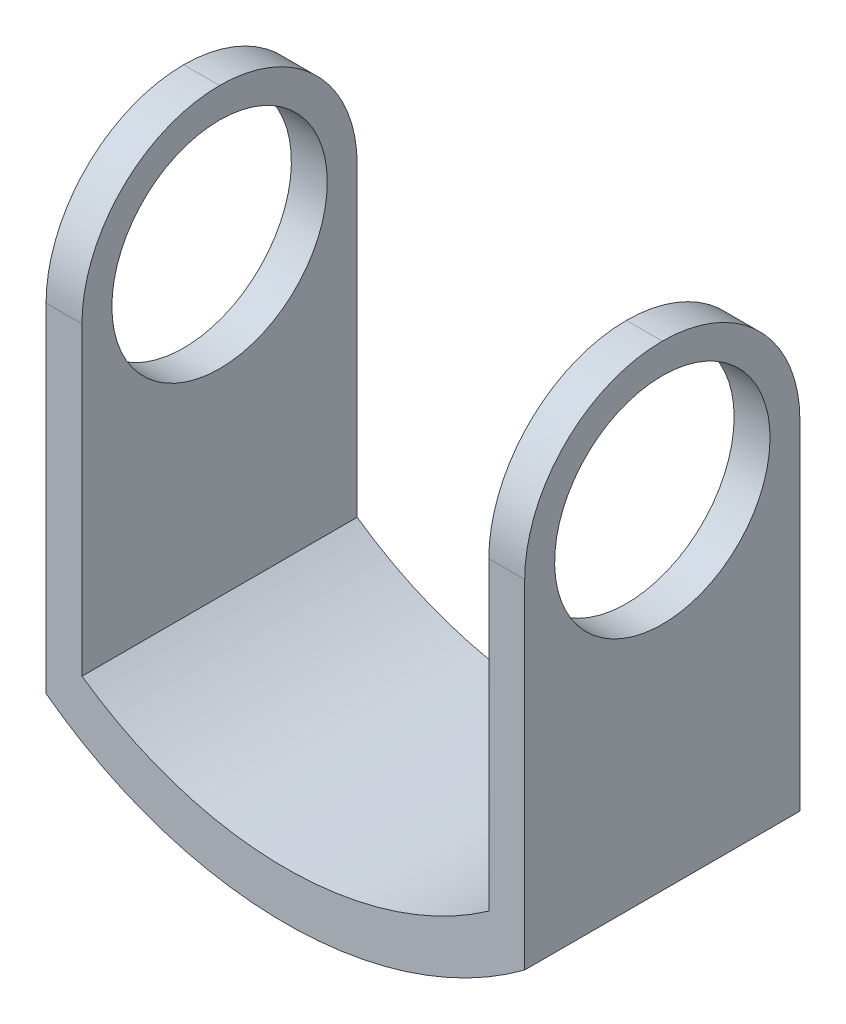
ISO-10303-21;
HEADER;
FILE_DESCRIPTION(('STEP AP214'),'2;1');
FILE_NAME('part.step','',(''),(''),'','','');
FILE_SCHEMA(('AUTOMOTIVE_DESIGN { 1 0 10303 214 1 1 1 1 }'));
ENDSEC;
DATA;
#1=APPLICATION_CONTEXT('core data for automotive mechanical design processes');
#2=APPLICATION_PROTOCOL_DEFINITION('international standard','automotive_design',2000,#1);
#3=PRODUCT_CONTEXT('',#1,'mechanical');
#4=PRODUCT('Part','Part','',(#3));
#5=PRODUCT_RELATED_PRODUCT_CATEGORY('part','',(#4));
#6=PRODUCT_DEFINITION_FORMATION('','',#4);
#7=PRODUCT_DEFINITION_CONTEXT('part definition',#1,'design');
#8=PRODUCT_DEFINITION('design','',#6,#7);
#9=PRODUCT_DEFINITION_SHAPE('','',#8);
#10=(LENGTH_UNIT() NAMED_UNIT(*) SI_UNIT(.MILLI.,.METRE.));
#11=(NAMED_UNIT(*) PLANE_ANGLE_UNIT() SI_UNIT($,.RADIAN.));
#12=(NAMED_UNIT(*) SI_UNIT($,.STERADIAN.) SOLID_ANGLE_UNIT());
#13=UNCERTAINTY_MEASURE_WITH_UNIT(LENGTH_MEASURE(1.E-05),#10,'distance_accuracy_value','');
#14=(GEOMETRIC_REPRESENTATION_CONTEXT(3) GLOBAL_UNCERTAINTY_ASSIGNED_CONTEXT((#13)) GLOBAL_UNIT_ASSIGNED_CONTEXT((#10,
#11,#12)) REPRESENTATION_CONTEXT('',''));
#15=CARTESIAN_POINT('',(0.,0.,0.));
#16=DIRECTION('',(0.,0.,1.));
#17=DIRECTION('',(1.,0.,0.));
#18=AXIS2_PLACEMENT_3D('',#15,#16,#17);
#19=CARTESIAN_POINT('',(-10.,0.,11.5));
#20=DIRECTION('',(1.,0.,0.));
#21=DIRECTION('',(0.,1.,0.));
#22=AXIS2_PLACEMENT_3D('',#19,#20,#21);
#23=PLANE('',#22);
#24=CARTESIAN_POINT('',(-10.,-5.75,5.75));
#25=DIRECTION('',(1.,0.,0.));
#26=DIRECTION('',(0.,1.,0.));
#27=AXIS2_PLACEMENT_3D('',#24,#25,#26);
#28=CIRCLE('',#27,4.5);
#29=CARTESIAN_POINT('',(-10.,-1.25,5.75));
#30=VERTEX_POINT('',#29);
#31=EDGE_CURVE('E149',#30,#30,#28,.F.);
#32=ORIENTED_EDGE('',*,*,#31,.F.);
#33=EDGE_LOOP('',(#32));
#34=FACE_BOUND('',#33,.T.);
#35=CARTESIAN_POINT('',(-10.,-5.75,5.75));
#36=DIRECTION('',(1.,0.,0.));
#37=DIRECTION('',(0.,1.,0.));
#38=AXIS2_PLACEMENT_3D('',#35,#36,#37);
#39=CIRCLE('',#38,5.75);
#40=CARTESIAN_POINT('',(-10.,-5.75,11.5));
#41=VERTEX_POINT('',#40);
#42=CARTESIAN_POINT('',(-10.,0.,5.75));
#43=VERTEX_POINT('',#42);
#44=EDGE_CURVE('E138',#41,#43,#39,.F.);
#45=ORIENTED_EDGE('',*,*,#44,.T.);
#46=CARTESIAN_POINT('',(-10.,-5.75,5.75));
#47=DIRECTION('',(1.,0.,0.));
#48=DIRECTION('',(0.,1.,0.));
#49=AXIS2_PLACEMENT_3D('',#46,#47,#48);
#50=CIRCLE('',#49,5.75);
#51=CARTESIAN_POINT('',(-10.,-5.75,0.));
#52=VERTEX_POINT('',#51);
#53=EDGE_CURVE('E140',#43,#52,#50,.F.);
#54=ORIENTED_EDGE('',*,*,#53,.T.);
#55=DIRECTION('',(0.,-1.,0.));
#56=VECTOR('',#55,1.);
#57=CARTESIAN_POINT('',(-10.,0.,0.));
#58=LINE('',#57,#56);
#59=CARTESIAN_POINT('',(-9.99999999999999,-19.8827911991355,0.));
#60=VERTEX_POINT('',#59);
#61=EDGE_CURVE('E136',#52,#60,#58,.T.);
#62=ORIENTED_EDGE('',*,*,#61,.T.);
#63=DIRECTION('',(0.,0.,-1.));
#64=VECTOR('',#63,1.);
#65=CARTESIAN_POINT('',(-9.99999999999999,-19.8827911991355,11.5));
#66=LINE('',#65,#64);
#67=CARTESIAN_POINT('',(-9.99999999999999,-19.8827911991355,11.5));
#68=VERTEX_POINT('',#67);
#69=EDGE_CURVE('E129',#68,#60,#66,.T.);
#70=ORIENTED_EDGE('',*,*,#69,.F.);
#71=DIRECTION('',(0.,-1.,0.));
#72=VECTOR('',#71,1.);
#73=CARTESIAN_POINT('',(-10.,0.,11.5));
#74=LINE('',#73,#72);
#75=EDGE_CURVE('E112',#41,#68,#74,.T.);
#76=ORIENTED_EDGE('',*,*,#75,.F.);
#77=EDGE_LOOP('',(#45,#54,#62,#70,#76));
#78=FACE_BOUND('',#77,.T.);
#79=ADVANCED_FACE('F35',(#34,#78),#23,.F.);
#80=CARTESIAN_POINT('',(0.,-6.4454365487588,11.5));
#81=DIRECTION('',(0.,0.,-1.));
#82=DIRECTION('',(-1.,0.,0.));
#83=AXIS2_PLACEMENT_3D('',#80,#81,#82);
#84=CYLINDRICAL_SURFACE('',#83,16.75);
#85=CARTESIAN_POINT('',(0.,-6.4454365487588,0.));
#86=DIRECTION('',(0.,0.,1.));
#87=DIRECTION('',(1.,0.,0.));
#88=AXIS2_PLACEMENT_3D('',#85,#86,#87);
#89=CIRCLE('',#88,16.75);
#90=CARTESIAN_POINT('',(10.,-19.8827911991355,0.));
#91=VERTEX_POINT('',#90);
#92=EDGE_CURVE('E194',#60,#91,#89,.T.);
#93=ORIENTED_EDGE('',*,*,#92,.T.);
#94=DIRECTION('',(0.,0.,-1.));
#95=VECTOR('',#94,1.);
#96=CARTESIAN_POINT('',(10.,-19.8827911991355,11.5));
#97=LINE('',#96,#95);
#98=CARTESIAN_POINT('',(10.,-19.8827911991355,11.5));
#99=VERTEX_POINT('',#98);
#100=EDGE_CURVE('E131',#99,#91,#97,.T.);
#101=ORIENTED_EDGE('',*,*,#100,.F.);
#102=CARTESIAN_POINT('',(0.,-6.4454365487588,11.5));
#103=DIRECTION('',(0.,0.,1.));
#104=DIRECTION('',(1.,0.,0.));
#105=AXIS2_PLACEMENT_3D('',#102,#103,#104);
#106=CIRCLE('',#105,16.75);
#107=EDGE_CURVE('E117',#68,#99,#106,.T.);
#108=ORIENTED_EDGE('',*,*,#107,.F.);
#109=ORIENTED_EDGE('',*,*,#69,.T.);
#110=EDGE_LOOP('',(#93,#101,#108,#109));
#111=FACE_BOUND('',#110,.T.);
#112=ADVANCED_FACE('F128',(#111),#84,.T.);
#113=CARTESIAN_POINT('',(10.,0.,11.5));
#114=DIRECTION('',(-1.,0.,0.));
#115=DIRECTION('',(0.,-1.,0.));
#116=AXIS2_PLACEMENT_3D('',#113,#114,#115);
#117=PLANE('',#116);
#118=CARTESIAN_POINT('',(10.,-5.75,5.75));
#119=DIRECTION('',(1.,0.,0.));
#120=DIRECTION('',(0.,1.,0.));
#121=AXIS2_PLACEMENT_3D('',#118,#119,#120);
#122=CIRCLE('',#121,4.5);
#123=CARTESIAN_POINT('',(10.,-1.25,5.75));
#124=VERTEX_POINT('',#123);
#125=EDGE_CURVE('E170',#124,#124,#122,.T.);
#126=ORIENTED_EDGE('',*,*,#125,.F.);
#127=EDGE_LOOP('',(#126));
#128=FACE_BOUND('',#127,.T.);
#129=DIRECTION('',(0.,1.,0.));
#130=VECTOR('',#129,1.);
#131=CARTESIAN_POINT('',(10.,0.,0.));
#132=LINE('',#131,#130);
#133=CARTESIAN_POINT('',(10.,-5.75,0.));
#134=VERTEX_POINT('',#133);
#135=EDGE_CURVE('E196',#91,#134,#132,.T.);
#136=ORIENTED_EDGE('',*,*,#135,.T.);
#137=CARTESIAN_POINT('',(10.,-5.75,5.75));
#138=DIRECTION('',(-1.,0.,0.));
#139=DIRECTION('',(0.,-1.,0.));
#140=AXIS2_PLACEMENT_3D('',#137,#138,#139);
#141=CIRCLE('',#140,5.75);
#142=CARTESIAN_POINT('',(10.,0.,5.75));
#143=VERTEX_POINT('',#142);
#144=EDGE_CURVE('E11',#134,#143,#141,.F.);
#145=ORIENTED_EDGE('',*,*,#144,.T.);
#146=CARTESIAN_POINT('',(10.,-5.75,5.75));
#147=DIRECTION('',(-1.,0.,0.));
#148=DIRECTION('',(0.,-1.,0.));
#149=AXIS2_PLACEMENT_3D('',#146,#147,#148);
#150=CIRCLE('',#149,5.75);
#151=CARTESIAN_POINT('',(10.,-5.75,11.5));
#152=VERTEX_POINT('',#151);
#153=EDGE_CURVE('E44',#143,#152,#150,.F.);
#154=ORIENTED_EDGE('',*,*,#153,.T.);
#155=DIRECTION('',(0.,1.,0.));
#156=VECTOR('',#155,1.);
#157=CARTESIAN_POINT('',(10.,0.,11.5));
#158=LINE('',#157,#156);
#159=EDGE_CURVE('E133',#99,#152,#158,.T.);
#160=ORIENTED_EDGE('',*,*,#159,.F.);
#161=ORIENTED_EDGE('',*,*,#100,.T.);
#162=EDGE_LOOP('',(#136,#145,#154,#160,#161));
#163=FACE_BOUND('',#162,.T.);
#164=ADVANCED_FACE('F183',(#128,#163),#117,.F.);
#165=CARTESIAN_POINT('',(8.5,-18.5,11.5));
#166=DIRECTION('',(1.,0.,0.));
#167=DIRECTION('',(0.,0.,-1.));
#168=AXIS2_PLACEMENT_3D('',#165,#166,#167);
#169=PLANE('',#168);
#170=CARTESIAN_POINT('',(8.5,-5.75,5.75));
#171=DIRECTION('',(1.,0.,0.));
#172=DIRECTION('',(0.,0.,-1.));
#173=AXIS2_PLACEMENT_3D('',#170,#171,#172);
#174=CIRCLE('',#173,4.5);
#175=CARTESIAN_POINT('',(8.5,-5.75,1.25));
#176=VERTEX_POINT('',#175);
#177=EDGE_CURVE('E148',#176,#176,#174,.T.);
#178=ORIENTED_EDGE('',*,*,#177,.T.);
#179=EDGE_LOOP('',(#178));
#180=FACE_BOUND('',#179,.T.);
#181=CARTESIAN_POINT('',(8.5,-5.75,5.75));
#182=DIRECTION('',(1.,0.,0.));
#183=DIRECTION('',(0.,0.,-1.));
#184=AXIS2_PLACEMENT_3D('',#181,#182,#183);
#185=CIRCLE('',#184,5.75);
#186=CARTESIAN_POINT('',(8.5,-5.75,11.5));
#187=VERTEX_POINT('',#186);
#188=CARTESIAN_POINT('',(8.5,0.,5.75));
#189=VERTEX_POINT('',#188);
#190=EDGE_CURVE('E58',#187,#189,#185,.F.);
#191=ORIENTED_EDGE('',*,*,#190,.T.);
#192=CARTESIAN_POINT('',(8.5,-5.75,5.75));
#193=DIRECTION('',(1.,0.,0.));
#194=DIRECTION('',(0.,0.,-1.));
#195=AXIS2_PLACEMENT_3D('',#192,#193,#194);
#196=CIRCLE('',#195,5.75);
#197=CARTESIAN_POINT('',(8.5,-5.75,0.));
#198=VERTEX_POINT('',#197);
#199=EDGE_CURVE('E166',#189,#198,#196,.F.);
#200=ORIENTED_EDGE('',*,*,#199,.T.);
#201=DIRECTION('',(0.,-1.,0.));
#202=VECTOR('',#201,1.);
#203=CARTESIAN_POINT('',(8.5,-18.5,0.));
#204=LINE('',#203,#202);
#205=CARTESIAN_POINT('',(8.5,-18.5,0.));
#206=VERTEX_POINT('',#205);
#207=EDGE_CURVE('E198',#198,#206,#204,.T.);
#208=ORIENTED_EDGE('',*,*,#207,.T.);
#209=DIRECTION('',(0.,0.,-1.));
#210=VECTOR('',#209,1.);
#211=CARTESIAN_POINT('',(8.5,-18.5,11.5));
#212=LINE('',#211,#210);
#213=CARTESIAN_POINT('',(8.5,-18.5,11.5));
#214=VERTEX_POINT('',#213);
#215=EDGE_CURVE('E142',#214,#206,#212,.T.);
#216=ORIENTED_EDGE('',*,*,#215,.F.);
#217=DIRECTION('',(0.,-1.,0.));
#218=VECTOR('',#217,1.);
#219=CARTESIAN_POINT('',(8.5,-18.5,11.5));
#220=LINE('',#219,#218);
#221=EDGE_CURVE('E184',#187,#214,#220,.T.);
#222=ORIENTED_EDGE('',*,*,#221,.F.);
#223=EDGE_LOOP('',(#191,#200,#208,#216,#222));
#224=FACE_BOUND('',#223,.T.);
#225=ADVANCED_FACE('F245',(#180,#224),#169,.F.);
#226=CARTESIAN_POINT('',(0.,-6.4454365487588,11.5));
#227=DIRECTION('',(0.,0.,-1.));
#228=DIRECTION('',(-1.,0.,0.));
#229=AXIS2_PLACEMENT_3D('',#226,#227,#228);
#230=CYLINDRICAL_SURFACE('',#229,14.75);
#231=CARTESIAN_POINT('',(0.,-6.4454365487588,0.));
#232=DIRECTION('',(0.,0.,-1.));
#233=DIRECTION('',(1.,0.,0.));
#234=AXIS2_PLACEMENT_3D('',#231,#232,#233);
#235=CIRCLE('',#234,14.75);
#236=CARTESIAN_POINT('',(-8.49999999999999,-18.5,0.));
#237=VERTEX_POINT('',#236);
#238=EDGE_CURVE('E200',#206,#237,#235,.T.);
#239=ORIENTED_EDGE('',*,*,#238,.T.);
#240=DIRECTION('',(0.,0.,-1.));
#241=VECTOR('',#240,1.);
#242=CARTESIAN_POINT('',(-8.49999999999999,-18.5,11.5));
#243=LINE('',#242,#241);
#244=CARTESIAN_POINT('',(-8.49999999999999,-18.5,11.5));
#245=VERTEX_POINT('',#244);
#246=EDGE_CURVE('E192',#245,#237,#243,.T.);
#247=ORIENTED_EDGE('',*,*,#246,.F.);
#248=CARTESIAN_POINT('',(0.,-6.4454365487588,11.5));
#249=DIRECTION('',(0.,0.,-1.));
#250=DIRECTION('',(1.,0.,0.));
#251=AXIS2_PLACEMENT_3D('',#248,#249,#250);
#252=CIRCLE('',#251,14.75);
#253=EDGE_CURVE('E186',#214,#245,#252,.T.);
#254=ORIENTED_EDGE('',*,*,#253,.F.);
#255=ORIENTED_EDGE('',*,*,#215,.T.);
#256=EDGE_LOOP('',(#239,#247,#254,#255));
#257=FACE_BOUND('',#256,.T.);
#258=ADVANCED_FACE('F210',(#257),#230,.F.);
#259=CARTESIAN_POINT('',(-8.49999999999999,-18.5,11.5));
#260=DIRECTION('',(-1.,0.,0.));
#261=DIRECTION('',(0.,-1.,0.));
#262=AXIS2_PLACEMENT_3D('',#259,#260,#261);
#263=PLANE('',#262);
#264=CARTESIAN_POINT('',(-8.5,-5.75,5.75));
#265=DIRECTION('',(-1.,0.,0.));
#266=DIRECTION('',(0.,-1.,0.));
#267=AXIS2_PLACEMENT_3D('',#264,#265,#266);
#268=CIRCLE('',#267,4.5);
#269=CARTESIAN_POINT('',(-8.5,-10.25,5.75));
#270=VERTEX_POINT('',#269);
#271=EDGE_CURVE('E146',#270,#270,#268,.T.);
#272=ORIENTED_EDGE('',*,*,#271,.T.);
#273=EDGE_LOOP('',(#272));
#274=FACE_BOUND('',#273,.T.);
#275=DIRECTION('',(0.,1.,0.));
#276=VECTOR('',#275,1.);
#277=CARTESIAN_POINT('',(-8.49999999999999,-18.5,0.));
#278=LINE('',#277,#276);
#279=CARTESIAN_POINT('',(-8.5,-5.75,0.));
#280=VERTEX_POINT('',#279);
#281=EDGE_CURVE('E124',#237,#280,#278,.T.);
#282=ORIENTED_EDGE('',*,*,#281,.T.);
#283=CARTESIAN_POINT('',(-8.5,-5.75,5.75));
#284=DIRECTION('',(-1.,0.,0.));
#285=DIRECTION('',(0.,-1.,0.));
#286=AXIS2_PLACEMENT_3D('',#283,#284,#285);
#287=CIRCLE('',#286,5.75);
#288=CARTESIAN_POINT('',(-8.5,0.,5.75));
#289=VERTEX_POINT('',#288);
#290=EDGE_CURVE('E160',#280,#289,#287,.F.);
#291=ORIENTED_EDGE('',*,*,#290,.T.);
#292=CARTESIAN_POINT('',(-8.5,-5.75,5.75));
#293=DIRECTION('',(-1.,0.,0.));
#294=DIRECTION('',(0.,-1.,0.));
#295=AXIS2_PLACEMENT_3D('',#292,#293,#294);
#296=CIRCLE('',#295,5.75);
#297=CARTESIAN_POINT('',(-8.5,-5.75,11.5));
#298=VERTEX_POINT('',#297);
#299=EDGE_CURVE('E158',#289,#298,#296,.F.);
#300=ORIENTED_EDGE('',*,*,#299,.T.);
#301=DIRECTION('',(0.,1.,0.));
#302=VECTOR('',#301,1.);
#303=CARTESIAN_POINT('',(-8.49999999999999,-18.5,11.5));
#304=LINE('',#303,#302);
#305=EDGE_CURVE('E190',#245,#298,#304,.T.);
#306=ORIENTED_EDGE('',*,*,#305,.F.);
#307=ORIENTED_EDGE('',*,*,#246,.T.);
#308=EDGE_LOOP('',(#282,#291,#300,#306,#307));
#309=FACE_BOUND('',#308,.T.);
#310=ADVANCED_FACE('F218',(#274,#309),#263,.F.);
#311=CARTESIAN_POINT('',(0.,-6.4454365487588,11.5));
#312=DIRECTION('',(0.,0.,1.));
#313=DIRECTION('',(1.,0.,0.));
#314=AXIS2_PLACEMENT_3D('',#311,#312,#313);
#315=PLANE('',#314);
#316=ORIENTED_EDGE('',*,*,#305,.T.);
#317=DIRECTION('',(-1.,0.,0.));
#318=VECTOR('',#317,1.);
#319=CARTESIAN_POINT('',(-10.,-5.75,11.5));
#320=LINE('',#319,#318);
#321=EDGE_CURVE('E120',#298,#41,#320,.T.);
#322=ORIENTED_EDGE('',*,*,#321,.T.);
#323=ORIENTED_EDGE('',*,*,#75,.T.);
#324=ORIENTED_EDGE('',*,*,#107,.T.);
#325=ORIENTED_EDGE('',*,*,#159,.T.);
#326=DIRECTION('',(-1.,0.,0.));
#327=VECTOR('',#326,1.);
#328=CARTESIAN_POINT('',(8.5,-5.75,11.5));
#329=LINE('',#328,#327);
#330=EDGE_CURVE('E162',#152,#187,#329,.T.);
#331=ORIENTED_EDGE('',*,*,#330,.T.);
#332=ORIENTED_EDGE('',*,*,#221,.T.);
#333=ORIENTED_EDGE('',*,*,#253,.T.);
#334=EDGE_LOOP('',(#316,#322,#323,#324,#325,#331,#332,#333));
#335=FACE_BOUND('',#334,.T.);
#336=ADVANCED_FACE('F115',(#335),#315,.T.);
#337=CARTESIAN_POINT('',(0.,-6.4454365487588,0.));
#338=DIRECTION('',(0.,0.,1.));
#339=DIRECTION('',(1.,0.,0.));
#340=AXIS2_PLACEMENT_3D('',#337,#338,#339);
#341=PLANE('',#340);
#342=ORIENTED_EDGE('',*,*,#61,.F.);
#343=DIRECTION('',(-1.,0.,0.));
#344=VECTOR('',#343,1.);
#345=CARTESIAN_POINT('',(0.,-5.75,0.));
#346=LINE('',#345,#344);
#347=EDGE_CURVE('E155',#52,#280,#346,.F.);
#348=ORIENTED_EDGE('',*,*,#347,.T.);
#349=ORIENTED_EDGE('',*,*,#281,.F.);
#350=ORIENTED_EDGE('',*,*,#238,.F.);
#351=ORIENTED_EDGE('',*,*,#207,.F.);
#352=DIRECTION('',(-1.,0.,0.));
#353=VECTOR('',#352,1.);
#354=CARTESIAN_POINT('',(0.,-5.74999999999999,0.));
#355=LINE('',#354,#353);
#356=EDGE_CURVE('E152',#198,#134,#355,.F.);
#357=ORIENTED_EDGE('',*,*,#356,.T.);
#358=ORIENTED_EDGE('',*,*,#135,.F.);
#359=ORIENTED_EDGE('',*,*,#92,.F.);
#360=EDGE_LOOP('',(#342,#348,#349,#350,#351,#357,#358,#359));
#361=FACE_BOUND('',#360,.T.);
#362=ADVANCED_FACE('F215',(#361),#341,.F.);
#363=CARTESIAN_POINT('',(-22.7279220613579,-5.75,5.75));
#364=DIRECTION('',(1.,0.,0.));
#365=DIRECTION('',(0.,1.,0.));
#366=AXIS2_PLACEMENT_3D('',#363,#364,#365);
#367=CYLINDRICAL_SURFACE('',#366,4.5);
#368=ORIENTED_EDGE('',*,*,#31,.T.);
#369=EDGE_LOOP('',(#368));
#370=FACE_BOUND('',#369,.T.);
#371=ORIENTED_EDGE('',*,*,#271,.F.);
#372=EDGE_LOOP('',(#371));
#373=FACE_BOUND('',#372,.T.);
#374=ADVANCED_FACE('F257',(#370,#373),#367,.F.);
#375=ORIENTED_EDGE('',*,*,#125,.T.);
#376=EDGE_LOOP('',(#375));
#377=FACE_BOUND('',#376,.T.);
#378=ORIENTED_EDGE('',*,*,#177,.F.);
#379=EDGE_LOOP('',(#378));
#380=FACE_BOUND('',#379,.T.);
#381=ADVANCED_FACE('F231',(#377,#380),#367,.F.);
#382=CARTESIAN_POINT('',(0.,-5.75,5.75));
#383=DIRECTION('',(1.,0.,0.));
#384=DIRECTION('',(0.,0.,-1.));
#385=AXIS2_PLACEMENT_3D('',#382,#383,#384);
#386=CYLINDRICAL_SURFACE('',#385,5.75);
#387=ORIENTED_EDGE('',*,*,#321,.F.);
#388=ORIENTED_EDGE('',*,*,#299,.F.);
#389=DIRECTION('',(-1.,0.,0.));
#390=VECTOR('',#389,1.);
#391=CARTESIAN_POINT('',(-8.5,0.,5.75));
#392=LINE('',#391,#390);
#393=EDGE_CURVE('E168',#43,#289,#392,.F.);
#394=ORIENTED_EDGE('',*,*,#393,.F.);
#395=ORIENTED_EDGE('',*,*,#44,.F.);
#396=EDGE_LOOP('',(#387,#388,#394,#395));
#397=FACE_BOUND('',#396,.T.);
#398=ADVANCED_FACE('F222',(#397),#386,.T.);
#399=CARTESIAN_POINT('',(-10.,-5.75,5.75));
#400=DIRECTION('',(-1.,0.,0.));
#401=DIRECTION('',(0.,0.,1.));
#402=AXIS2_PLACEMENT_3D('',#399,#400,#401);
#403=CYLINDRICAL_SURFACE('',#402,5.75);
#404=ORIENTED_EDGE('',*,*,#290,.F.);
#405=ORIENTED_EDGE('',*,*,#347,.F.);
#406=ORIENTED_EDGE('',*,*,#53,.F.);
#407=ORIENTED_EDGE('',*,*,#393,.T.);
#408=EDGE_LOOP('',(#404,#405,#406,#407));
#409=FACE_BOUND('',#408,.T.);
#410=ADVANCED_FACE('F224',(#409),#403,.T.);
#411=CARTESIAN_POINT('',(0.,-5.74999999999999,5.75));
#412=DIRECTION('',(1.,0.,0.));
#413=DIRECTION('',(0.,1.,0.));
#414=AXIS2_PLACEMENT_3D('',#411,#412,#413);
#415=CYLINDRICAL_SURFACE('',#414,5.75);
#416=ORIENTED_EDGE('',*,*,#330,.F.);
#417=ORIENTED_EDGE('',*,*,#153,.F.);
#418=DIRECTION('',(-1.,0.,0.));
#419=VECTOR('',#418,1.);
#420=CARTESIAN_POINT('',(10.,0.,5.75));
#421=LINE('',#420,#419);
#422=EDGE_CURVE('E39',#189,#143,#421,.F.);
#423=ORIENTED_EDGE('',*,*,#422,.F.);
#424=ORIENTED_EDGE('',*,*,#190,.F.);
#425=EDGE_LOOP('',(#416,#417,#423,#424));
#426=FACE_BOUND('',#425,.T.);
#427=ADVANCED_FACE('F37',(#426),#415,.T.);
#428=CARTESIAN_POINT('',(8.5,-5.75,5.75));
#429=DIRECTION('',(-1.,0.,0.));
#430=DIRECTION('',(0.,-1.,0.));
#431=AXIS2_PLACEMENT_3D('',#428,#429,#430);
#432=CYLINDRICAL_SURFACE('',#431,5.75);
#433=ORIENTED_EDGE('',*,*,#144,.F.);
#434=ORIENTED_EDGE('',*,*,#356,.F.);
#435=ORIENTED_EDGE('',*,*,#199,.F.);
#436=ORIENTED_EDGE('',*,*,#422,.T.);
#437=EDGE_LOOP('',(#433,#434,#435,#436));
#438=FACE_BOUND('',#437,.T.);
#439=ADVANCED_FACE('F179',(#438),#432,.T.);
#440=CLOSED_SHELL('',(#79,#112,#164,#225,#258,#310,#336,#362,#374,#381,#398,#410,#427,#439));
#441=MANIFOLD_SOLID_BREP('B2',#440);
#442=ADVANCED_BREP_SHAPE_REPRESENTATION('',(#18,#441),#14);
#443=SHAPE_DEFINITION_REPRESENTATION(#9,#442);
ENDSEC;
END-ISO-10303-21;
